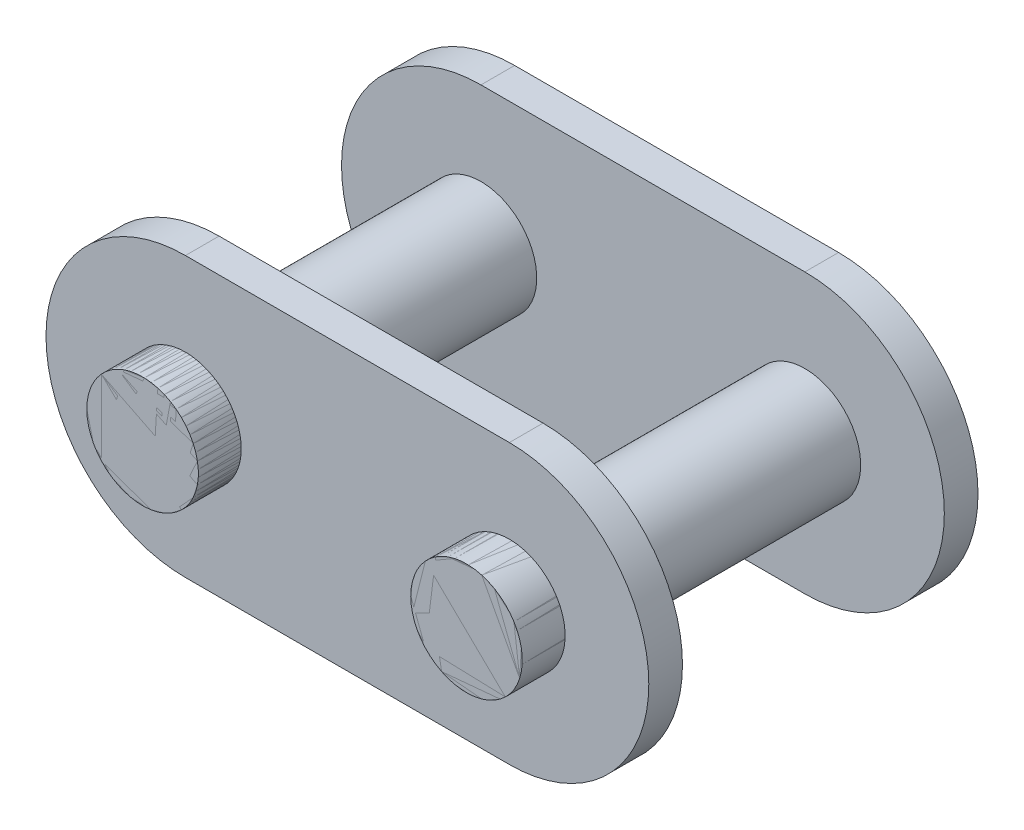
ISO-10303-21;
HEADER;
FILE_DESCRIPTION(('STEP AP214'),'2;1');
FILE_NAME('part.step','',(''),(''),'','','');
FILE_SCHEMA(('AUTOMOTIVE_DESIGN { 1 0 10303 214 1 1 1 1 }'));
ENDSEC;
DATA;
#1=APPLICATION_CONTEXT('core data for automotive mechanical design processes');
#2=APPLICATION_PROTOCOL_DEFINITION('international standard','automotive_design',2000,#1);
#3=PRODUCT_CONTEXT('',#1,'mechanical');
#4=PRODUCT('Part','Part','',(#3));
#5=PRODUCT_RELATED_PRODUCT_CATEGORY('part','',(#4));
#6=PRODUCT_DEFINITION_FORMATION('','',#4);
#7=PRODUCT_DEFINITION_CONTEXT('part definition',#1,'design');
#8=PRODUCT_DEFINITION('design','',#6,#7);
#9=PRODUCT_DEFINITION_SHAPE('','',#8);
#10=(LENGTH_UNIT() NAMED_UNIT(*) SI_UNIT(.MILLI.,.METRE.));
#11=(NAMED_UNIT(*) PLANE_ANGLE_UNIT() SI_UNIT($,.RADIAN.));
#12=(NAMED_UNIT(*) SI_UNIT($,.STERADIAN.) SOLID_ANGLE_UNIT());
#13=UNCERTAINTY_MEASURE_WITH_UNIT(LENGTH_MEASURE(1.E-05),#10,'distance_accuracy_value','');
#14=(GEOMETRIC_REPRESENTATION_CONTEXT(3) GLOBAL_UNCERTAINTY_ASSIGNED_CONTEXT((#13)) GLOBAL_UNIT_ASSIGNED_CONTEXT((#10,
#11,#12)) REPRESENTATION_CONTEXT('',''));
#15=CARTESIAN_POINT('',(0.,0.,0.));
#16=DIRECTION('',(0.,0.,1.));
#17=DIRECTION('',(1.,0.,0.));
#18=AXIS2_PLACEMENT_3D('',#15,#16,#17);
#19=CARTESIAN_POINT('',(9.525,0.,-8.69));
#20=DIRECTION('',(0.,0.,1.));
#21=DIRECTION('',(-1.,0.,0.));
#22=AXIS2_PLACEMENT_3D('',#19,#20,#21);
#23=PLANE('',#22);
#24=CARTESIAN_POINT('',(9.525,0.,-8.69));
#25=DIRECTION('',(0.,0.,1.));
#26=DIRECTION('',(-1.,0.,0.));
#27=AXIS2_PLACEMENT_3D('',#24,#25,#26);
#28=CIRCLE('',#27,4.1);
#29=CARTESIAN_POINT('',(9.525,-4.1,-8.69));
#30=VERTEX_POINT('',#29);
#31=CARTESIAN_POINT('',(9.525,4.1,-8.69));
#32=VERTEX_POINT('',#31);
#33=EDGE_CURVE('E111',#30,#32,#28,.T.);
#34=ORIENTED_EDGE('',*,*,#33,.F.);
#35=DIRECTION('',(1.,0.,0.));
#36=VECTOR('',#35,1.);
#37=CARTESIAN_POINT('',(0.,-4.1,-8.69));
#38=LINE('',#37,#36);
#39=CARTESIAN_POINT('',(0.,-4.1,-8.69));
#40=VERTEX_POINT('',#39);
#41=EDGE_CURVE('E114',#40,#30,#38,.T.);
#42=ORIENTED_EDGE('',*,*,#41,.F.);
#43=CARTESIAN_POINT('',(0.,0.,-8.69));
#44=DIRECTION('',(0.,0.,1.));
#45=DIRECTION('',(1.,0.,0.));
#46=AXIS2_PLACEMENT_3D('',#43,#44,#45);
#47=CIRCLE('',#46,4.1);
#48=CARTESIAN_POINT('',(0.,4.1,-8.69));
#49=VERTEX_POINT('',#48);
#50=EDGE_CURVE('E102',#49,#40,#47,.T.);
#51=ORIENTED_EDGE('',*,*,#50,.F.);
#52=DIRECTION('',(-1.,0.,0.));
#53=VECTOR('',#52,1.);
#54=CARTESIAN_POINT('',(0.,4.1,-8.69));
#55=LINE('',#54,#53);
#56=EDGE_CURVE('E107',#32,#49,#55,.T.);
#57=ORIENTED_EDGE('',*,*,#56,.F.);
#58=EDGE_LOOP('',(#34,#42,#51,#57));
#59=FACE_BOUND('',#58,.T.);
#60=CARTESIAN_POINT('',(0.,0.,-8.69));
#61=DIRECTION('',(0.,0.,1.));
#62=DIRECTION('',(1.,0.,0.));
#63=AXIS2_PLACEMENT_3D('',#60,#61,#62);
#64=CIRCLE('',#63,1.64);
#65=CARTESIAN_POINT('',(1.64,0.,-8.69));
#66=VERTEX_POINT('',#65);
#67=EDGE_CURVE('E123',#66,#66,#64,.T.);
#68=ORIENTED_EDGE('',*,*,#67,.T.);
#69=EDGE_LOOP('',(#68));
#70=FACE_BOUND('',#69,.T.);
#71=CARTESIAN_POINT('',(9.525,0.,-8.69));
#72=DIRECTION('',(0.,0.,1.));
#73=DIRECTION('',(-1.,0.,0.));
#74=AXIS2_PLACEMENT_3D('',#71,#72,#73);
#75=CIRCLE('',#74,1.64);
#76=CARTESIAN_POINT('',(7.88500000000001,0.,-8.69));
#77=VERTEX_POINT('',#76);
#78=EDGE_CURVE('E133',#77,#77,#75,.T.);
#79=ORIENTED_EDGE('',*,*,#78,.T.);
#80=EDGE_LOOP('',(#79));
#81=FACE_BOUND('',#80,.T.);
#82=ADVANCED_FACE('F55',(#59,#70,#81),#23,.F.);
#83=CARTESIAN_POINT('',(9.525,0.,-7.7));
#84=DIRECTION('',(0.,0.,1.));
#85=DIRECTION('',(-1.,0.,0.));
#86=AXIS2_PLACEMENT_3D('',#83,#84,#85);
#87=PLANE('',#86);
#88=CARTESIAN_POINT('',(0.,0.,-7.7));
#89=DIRECTION('',(0.,0.,-1.));
#90=DIRECTION('',(-1.,0.,0.));
#91=AXIS2_PLACEMENT_3D('',#88,#89,#90);
#92=CIRCLE('',#91,1.64);
#93=CARTESIAN_POINT('',(-1.64,0.,-7.7));
#94=VERTEX_POINT('',#93);
#95=EDGE_CURVE('E145',#94,#94,#92,.T.);
#96=ORIENTED_EDGE('',*,*,#95,.T.);
#97=EDGE_LOOP('',(#96));
#98=FACE_BOUND('',#97,.T.);
#99=CARTESIAN_POINT('',(9.525,0.,-7.7));
#100=DIRECTION('',(0.,0.,1.));
#101=DIRECTION('',(-1.,0.,0.));
#102=AXIS2_PLACEMENT_3D('',#99,#100,#101);
#103=CIRCLE('',#102,4.1);
#104=CARTESIAN_POINT('',(9.525,-4.1,-7.7));
#105=VERTEX_POINT('',#104);
#106=CARTESIAN_POINT('',(9.525,4.1,-7.7));
#107=VERTEX_POINT('',#106);
#108=EDGE_CURVE('E119',#105,#107,#103,.T.);
#109=ORIENTED_EDGE('',*,*,#108,.T.);
#110=DIRECTION('',(-1.,0.,0.));
#111=VECTOR('',#110,1.);
#112=CARTESIAN_POINT('',(0.,4.1,-7.7));
#113=LINE('',#112,#111);
#114=CARTESIAN_POINT('',(0.,4.1,-7.7));
#115=VERTEX_POINT('',#114);
#116=EDGE_CURVE('E122',#107,#115,#113,.T.);
#117=ORIENTED_EDGE('',*,*,#116,.T.);
#118=CARTESIAN_POINT('',(0.,0.,-7.7));
#119=DIRECTION('',(0.,0.,1.));
#120=DIRECTION('',(1.,0.,0.));
#121=AXIS2_PLACEMENT_3D('',#118,#119,#120);
#122=CIRCLE('',#121,4.1);
#123=CARTESIAN_POINT('',(0.,-4.1,-7.7));
#124=VERTEX_POINT('',#123);
#125=EDGE_CURVE('E105',#115,#124,#122,.T.);
#126=ORIENTED_EDGE('',*,*,#125,.T.);
#127=DIRECTION('',(1.,0.,0.));
#128=VECTOR('',#127,1.);
#129=CARTESIAN_POINT('',(0.,-4.1,-7.7));
#130=LINE('',#129,#128);
#131=EDGE_CURVE('E126',#124,#105,#130,.T.);
#132=ORIENTED_EDGE('',*,*,#131,.T.);
#133=EDGE_LOOP('',(#109,#117,#126,#132));
#134=FACE_BOUND('',#133,.T.);
#135=CARTESIAN_POINT('',(9.525,0.,-7.7));
#136=DIRECTION('',(0.,0.,-1.));
#137=DIRECTION('',(-1.,0.,0.));
#138=AXIS2_PLACEMENT_3D('',#135,#136,#137);
#139=CIRCLE('',#138,1.64);
#140=CARTESIAN_POINT('',(7.885,0.,-7.7));
#141=VERTEX_POINT('',#140);
#142=EDGE_CURVE('E136',#141,#141,#139,.T.);
#143=ORIENTED_EDGE('',*,*,#142,.T.);
#144=EDGE_LOOP('',(#143));
#145=FACE_BOUND('',#144,.T.);
#146=ADVANCED_FACE('F165',(#98,#134,#145),#87,.T.);
#147=CARTESIAN_POINT('',(9.525,0.,-8.69));
#148=DIRECTION('',(0.,0.,1.));
#149=DIRECTION('',(-1.,0.,0.));
#150=AXIS2_PLACEMENT_3D('',#147,#148,#149);
#151=CYLINDRICAL_SURFACE('',#150,4.1);
#152=ORIENTED_EDGE('',*,*,#108,.F.);
#153=DIRECTION('',(0.,0.,1.));
#154=VECTOR('',#153,1.);
#155=CARTESIAN_POINT('',(9.525,-4.1,-8.69));
#156=LINE('',#155,#154);
#157=EDGE_CURVE('E72',#30,#105,#156,.T.);
#158=ORIENTED_EDGE('',*,*,#157,.F.);
#159=ORIENTED_EDGE('',*,*,#33,.T.);
#160=DIRECTION('',(0.,0.,1.));
#161=VECTOR('',#160,1.);
#162=CARTESIAN_POINT('',(9.525,4.1,-8.69));
#163=LINE('',#162,#161);
#164=EDGE_CURVE('E12',#32,#107,#163,.T.);
#165=ORIENTED_EDGE('',*,*,#164,.T.);
#166=EDGE_LOOP('',(#152,#158,#159,#165));
#167=FACE_BOUND('',#166,.T.);
#168=ADVANCED_FACE('F57',(#167),#151,.T.);
#169=CARTESIAN_POINT('',(0.,4.1,-8.69));
#170=DIRECTION('',(0.,-1.,0.));
#171=DIRECTION('',(1.,0.,0.));
#172=AXIS2_PLACEMENT_3D('',#169,#170,#171);
#173=PLANE('',#172);
#174=ORIENTED_EDGE('',*,*,#116,.F.);
#175=ORIENTED_EDGE('',*,*,#164,.F.);
#176=ORIENTED_EDGE('',*,*,#56,.T.);
#177=DIRECTION('',(0.,0.,1.));
#178=VECTOR('',#177,1.);
#179=CARTESIAN_POINT('',(0.,4.1,-8.69));
#180=LINE('',#179,#178);
#181=EDGE_CURVE('E64',#49,#115,#180,.T.);
#182=ORIENTED_EDGE('',*,*,#181,.T.);
#183=EDGE_LOOP('',(#174,#175,#176,#182));
#184=FACE_BOUND('',#183,.T.);
#185=ADVANCED_FACE('F108',(#184),#173,.F.);
#186=CARTESIAN_POINT('',(0.,0.,-8.69));
#187=DIRECTION('',(0.,0.,1.));
#188=DIRECTION('',(-1.,0.,0.));
#189=AXIS2_PLACEMENT_3D('',#186,#187,#188);
#190=CYLINDRICAL_SURFACE('',#189,4.1);
#191=ORIENTED_EDGE('',*,*,#125,.F.);
#192=ORIENTED_EDGE('',*,*,#181,.F.);
#193=ORIENTED_EDGE('',*,*,#50,.T.);
#194=DIRECTION('',(0.,0.,1.));
#195=VECTOR('',#194,1.);
#196=CARTESIAN_POINT('',(0.,-4.1,-8.69));
#197=LINE('',#196,#195);
#198=EDGE_CURVE('E88',#40,#124,#197,.T.);
#199=ORIENTED_EDGE('',*,*,#198,.T.);
#200=EDGE_LOOP('',(#191,#192,#193,#199));
#201=FACE_BOUND('',#200,.T.);
#202=ADVANCED_FACE('F100',(#201),#190,.T.);
#203=CARTESIAN_POINT('',(0.,-4.1,-8.69));
#204=DIRECTION('',(0.,1.,0.));
#205=DIRECTION('',(-1.,0.,0.));
#206=AXIS2_PLACEMENT_3D('',#203,#204,#205);
#207=PLANE('',#206);
#208=ORIENTED_EDGE('',*,*,#131,.F.);
#209=ORIENTED_EDGE('',*,*,#198,.F.);
#210=ORIENTED_EDGE('',*,*,#41,.T.);
#211=ORIENTED_EDGE('',*,*,#157,.T.);
#212=EDGE_LOOP('',(#208,#209,#210,#211));
#213=FACE_BOUND('',#212,.T.);
#214=ADVANCED_FACE('F190',(#213),#207,.F.);
#215=CARTESIAN_POINT('',(9.525,0.,2.25));
#216=DIRECTION('',(0.,0.,1.));
#217=DIRECTION('',(-1.,0.,0.));
#218=AXIS2_PLACEMENT_3D('',#215,#216,#217);
#219=PLANE('',#218);
#220=CARTESIAN_POINT('',(9.525,0.,2.25));
#221=DIRECTION('',(0.,0.,-1.));
#222=DIRECTION('',(-1.,0.,0.));
#223=AXIS2_PLACEMENT_3D('',#220,#221,#222);
#224=CIRCLE('',#223,1.64);
#225=CARTESIAN_POINT('',(7.885,0.,2.25));
#226=VERTEX_POINT('',#225);
#227=EDGE_CURVE('E142',#226,#226,#224,.T.);
#228=ORIENTED_EDGE('',*,*,#227,.F.);
#229=EDGE_LOOP('',(#228));
#230=FACE_BOUND('',#229,.T.);
#231=ADVANCED_FACE('F182',(#230),#219,.T.);
#232=CARTESIAN_POINT('',(9.525,0.,-9.95));
#233=DIRECTION('',(0.,0.,1.));
#234=DIRECTION('',(-1.,0.,0.));
#235=AXIS2_PLACEMENT_3D('',#232,#233,#234);
#236=CYLINDRICAL_SURFACE('',#235,1.64);
#237=ORIENTED_EDGE('',*,*,#142,.F.);
#238=EDGE_LOOP('',(#237));
#239=FACE_BOUND('',#238,.T.);
#240=ORIENTED_EDGE('',*,*,#227,.T.);
#241=EDGE_LOOP('',(#240));
#242=FACE_BOUND('',#241,.T.);
#243=ADVANCED_FACE('F172',(#239,#242),#236,.T.);
#244=CARTESIAN_POINT('',(9.525,0.,-9.95));
#245=DIRECTION('',(0.,0.,-1.));
#246=DIRECTION('',(-1.,0.,0.));
#247=AXIS2_PLACEMENT_3D('',#244,#245,#246);
#248=CIRCLE('',#247,1.64);
#249=CARTESIAN_POINT('',(7.885,0.,-9.95));
#250=VERTEX_POINT('',#249);
#251=EDGE_CURVE('E139',#250,#250,#248,.T.);
#252=ORIENTED_EDGE('',*,*,#251,.F.);
#253=EDGE_LOOP('',(#252));
#254=FACE_BOUND('',#253,.T.);
#255=ORIENTED_EDGE('',*,*,#78,.F.);
#256=EDGE_LOOP('',(#255));
#257=FACE_BOUND('',#256,.T.);
#258=ADVANCED_FACE('F169',(#254,#257),#236,.T.);
#259=CARTESIAN_POINT('',(9.525,0.,-9.95));
#260=DIRECTION('',(0.,0.,1.));
#261=DIRECTION('',(-1.,0.,0.));
#262=AXIS2_PLACEMENT_3D('',#259,#260,#261);
#263=PLANE('',#262);
#264=ORIENTED_EDGE('',*,*,#251,.T.);
#265=EDGE_LOOP('',(#264));
#266=FACE_BOUND('',#265,.T.);
#267=ADVANCED_FACE('F171',(#266),#263,.F.);
#268=CARTESIAN_POINT('',(0.,0.,2.25));
#269=DIRECTION('',(0.,0.,1.));
#270=DIRECTION('',(-1.,0.,0.));
#271=AXIS2_PLACEMENT_3D('',#268,#269,#270);
#272=PLANE('',#271);
#273=CARTESIAN_POINT('',(0.,0.,2.25));
#274=DIRECTION('',(0.,0.,-1.));
#275=DIRECTION('',(-1.,0.,0.));
#276=AXIS2_PLACEMENT_3D('',#273,#274,#275);
#277=CIRCLE('',#276,1.64);
#278=CARTESIAN_POINT('',(-1.64,0.,2.25));
#279=VERTEX_POINT('',#278);
#280=EDGE_CURVE('E148',#279,#279,#277,.T.);
#281=ORIENTED_EDGE('',*,*,#280,.F.);
#282=EDGE_LOOP('',(#281));
#283=FACE_BOUND('',#282,.T.);
#284=ADVANCED_FACE('F179',(#283),#272,.T.);
#285=CARTESIAN_POINT('',(0.,0.,-9.95));
#286=DIRECTION('',(0.,0.,1.));
#287=DIRECTION('',(-1.,0.,0.));
#288=AXIS2_PLACEMENT_3D('',#285,#286,#287);
#289=CYLINDRICAL_SURFACE('',#288,1.64);
#290=ORIENTED_EDGE('',*,*,#95,.F.);
#291=EDGE_LOOP('',(#290));
#292=FACE_BOUND('',#291,.T.);
#293=ORIENTED_EDGE('',*,*,#280,.T.);
#294=EDGE_LOOP('',(#293));
#295=FACE_BOUND('',#294,.T.);
#296=ADVANCED_FACE('F160',(#292,#295),#289,.T.);
#297=CARTESIAN_POINT('',(0.,0.,-9.95));
#298=DIRECTION('',(0.,0.,-1.));
#299=DIRECTION('',(-1.,0.,0.));
#300=AXIS2_PLACEMENT_3D('',#297,#298,#299);
#301=CIRCLE('',#300,1.64);
#302=CARTESIAN_POINT('',(-1.64,0.,-9.95));
#303=VERTEX_POINT('',#302);
#304=EDGE_CURVE('E151',#303,#303,#301,.T.);
#305=ORIENTED_EDGE('',*,*,#304,.F.);
#306=EDGE_LOOP('',(#305));
#307=FACE_BOUND('',#306,.T.);
#308=ORIENTED_EDGE('',*,*,#67,.F.);
#309=EDGE_LOOP('',(#308));
#310=FACE_BOUND('',#309,.T.);
#311=ADVANCED_FACE('F157',(#307,#310),#289,.T.);
#312=CARTESIAN_POINT('',(0.,0.,-9.95));
#313=DIRECTION('',(0.,0.,1.));
#314=DIRECTION('',(-1.,0.,0.));
#315=AXIS2_PLACEMENT_3D('',#312,#313,#314);
#316=PLANE('',#315);
#317=ORIENTED_EDGE('',*,*,#304,.T.);
#318=EDGE_LOOP('',(#317));
#319=FACE_BOUND('',#318,.T.);
#320=ADVANCED_FACE('F155',(#319),#316,.F.);
#321=CLOSED_SHELL('',(#82,#146,#168,#185,#202,#214,#231,#243,#258,#267,#284,#296,#311,#320));
#322=MANIFOLD_SOLID_BREP('B2',#321);
#323=CARTESIAN_POINT('',(9.525,0.,0.99));
#324=DIRECTION('',(0.,0.,-1.));
#325=DIRECTION('',(-1.,0.,0.));
#326=AXIS2_PLACEMENT_3D('',#323,#324,#325);
#327=PLANE('',#326);
#328=CARTESIAN_POINT('',(9.525,0.,0.99));
#329=DIRECTION('',(0.,0.,1.));
#330=DIRECTION('',(-1.,0.,0.));
#331=AXIS2_PLACEMENT_3D('',#328,#329,#330);
#332=CIRCLE('',#331,4.1);
#333=CARTESIAN_POINT('',(9.525,-4.1,0.99));
#334=VERTEX_POINT('',#333);
#335=CARTESIAN_POINT('',(9.525,4.1,0.99));
#336=VERTEX_POINT('',#335);
#337=EDGE_CURVE('E350',#334,#336,#332,.T.);
#338=ORIENTED_EDGE('',*,*,#337,.T.);
#339=DIRECTION('',(-1.,0.,0.));
#340=VECTOR('',#339,1.);
#341=CARTESIAN_POINT('',(0.,4.1,0.99));
#342=LINE('',#341,#340);
#343=CARTESIAN_POINT('',(0.,4.1,0.99));
#344=VERTEX_POINT('',#343);
#345=EDGE_CURVE('E345',#336,#344,#342,.T.);
#346=ORIENTED_EDGE('',*,*,#345,.T.);
#347=CARTESIAN_POINT('',(0.,0.,0.99));
#348=DIRECTION('',(0.,0.,1.));
#349=DIRECTION('',(1.,0.,0.));
#350=AXIS2_PLACEMENT_3D('',#347,#348,#349);
#351=CIRCLE('',#350,4.1);
#352=CARTESIAN_POINT('',(0.,-4.1,0.99));
#353=VERTEX_POINT('',#352);
#354=EDGE_CURVE('E348',#344,#353,#351,.T.);
#355=ORIENTED_EDGE('',*,*,#354,.T.);
#356=DIRECTION('',(1.,0.,0.));
#357=VECTOR('',#356,1.);
#358=CARTESIAN_POINT('',(0.,-4.1,0.99));
#359=LINE('',#358,#357);
#360=EDGE_CURVE('E315',#353,#334,#359,.T.);
#361=ORIENTED_EDGE('',*,*,#360,.T.);
#362=EDGE_LOOP('',(#338,#346,#355,#361));
#363=FACE_BOUND('',#362,.T.);
#364=CARTESIAN_POINT('',(0.,0.,0.99));
#365=DIRECTION('',(0.,0.,1.));
#366=DIRECTION('',(1.,0.,0.));
#367=AXIS2_PLACEMENT_3D('',#364,#365,#366);
#368=CIRCLE('',#367,1.64);
#369=CARTESIAN_POINT('',(1.64,0.,0.99));
#370=VERTEX_POINT('',#369);
#371=EDGE_CURVE('E370',#370,#370,#368,.T.);
#372=ORIENTED_EDGE('',*,*,#371,.F.);
#373=EDGE_LOOP('',(#372));
#374=FACE_BOUND('',#373,.T.);
#375=CARTESIAN_POINT('',(9.525,0.,0.99));
#376=DIRECTION('',(0.,0.,1.));
#377=DIRECTION('',(-1.,0.,0.));
#378=AXIS2_PLACEMENT_3D('',#375,#376,#377);
#379=CIRCLE('',#378,1.64);
#380=CARTESIAN_POINT('',(7.88500000000001,0.,0.99));
#381=VERTEX_POINT('',#380);
#382=EDGE_CURVE('E391',#381,#381,#379,.T.);
#383=ORIENTED_EDGE('',*,*,#382,.F.);
#384=EDGE_LOOP('',(#383));
#385=FACE_BOUND('',#384,.T.);
#386=ADVANCED_FACE('F297',(#363,#374,#385),#327,.F.);
#387=CARTESIAN_POINT('',(9.525,0.,0.));
#388=DIRECTION('',(0.,0.,-1.));
#389=DIRECTION('',(-1.,0.,0.));
#390=AXIS2_PLACEMENT_3D('',#387,#388,#389);
#391=PLANE('',#390);
#392=CARTESIAN_POINT('',(0.,0.,0.));
#393=DIRECTION('',(0.,0.,-1.));
#394=DIRECTION('',(-1.,0.,0.));
#395=AXIS2_PLACEMENT_3D('',#392,#393,#394);
#396=CIRCLE('',#395,1.64);
#397=CARTESIAN_POINT('',(-1.64,0.,0.));
#398=VERTEX_POINT('',#397);
#399=EDGE_CURVE('E407',#398,#398,#396,.T.);
#400=ORIENTED_EDGE('',*,*,#399,.F.);
#401=EDGE_LOOP('',(#400));
#402=FACE_BOUND('',#401,.T.);
#403=CARTESIAN_POINT('',(9.525,0.,0.));
#404=DIRECTION('',(0.,0.,1.));
#405=DIRECTION('',(-1.,0.,0.));
#406=AXIS2_PLACEMENT_3D('',#403,#404,#405);
#407=CIRCLE('',#406,4.1);
#408=CARTESIAN_POINT('',(9.525,-4.1,0.));
#409=VERTEX_POINT('',#408);
#410=CARTESIAN_POINT('',(9.525,4.1,0.));
#411=VERTEX_POINT('',#410);
#412=EDGE_CURVE('E366',#409,#411,#407,.T.);
#413=ORIENTED_EDGE('',*,*,#412,.F.);
#414=DIRECTION('',(1.,0.,0.));
#415=VECTOR('',#414,1.);
#416=CARTESIAN_POINT('',(0.,-4.1,0.));
#417=LINE('',#416,#415);
#418=CARTESIAN_POINT('',(0.,-4.1,0.));
#419=VERTEX_POINT('',#418);
#420=EDGE_CURVE('E338',#419,#409,#417,.T.);
#421=ORIENTED_EDGE('',*,*,#420,.F.);
#422=CARTESIAN_POINT('',(0.,0.,0.));
#423=DIRECTION('',(0.,0.,1.));
#424=DIRECTION('',(1.,0.,0.));
#425=AXIS2_PLACEMENT_3D('',#422,#423,#424);
#426=CIRCLE('',#425,4.1);
#427=CARTESIAN_POINT('',(0.,4.1,0.));
#428=VERTEX_POINT('',#427);
#429=EDGE_CURVE('E332',#428,#419,#426,.T.);
#430=ORIENTED_EDGE('',*,*,#429,.F.);
#431=DIRECTION('',(-1.,0.,0.));
#432=VECTOR('',#431,1.);
#433=CARTESIAN_POINT('',(0.,4.1,0.));
#434=LINE('',#433,#432);
#435=EDGE_CURVE('E355',#411,#428,#434,.T.);
#436=ORIENTED_EDGE('',*,*,#435,.F.);
#437=EDGE_LOOP('',(#413,#421,#430,#436));
#438=FACE_BOUND('',#437,.T.);
#439=CARTESIAN_POINT('',(9.525,0.,0.));
#440=DIRECTION('',(0.,0.,-1.));
#441=DIRECTION('',(-1.,0.,0.));
#442=AXIS2_PLACEMENT_3D('',#439,#440,#441);
#443=CIRCLE('',#442,1.64);
#444=CARTESIAN_POINT('',(7.885,0.,0.));
#445=VERTEX_POINT('',#444);
#446=EDGE_CURVE('E395',#445,#445,#443,.T.);
#447=ORIENTED_EDGE('',*,*,#446,.F.);
#448=EDGE_LOOP('',(#447));
#449=FACE_BOUND('',#448,.T.);
#450=ADVANCED_FACE('F383',(#402,#438,#449),#391,.T.);
#451=CARTESIAN_POINT('',(9.525,0.,0.99));
#452=DIRECTION('',(0.,0.,-1.));
#453=DIRECTION('',(-1.,0.,0.));
#454=AXIS2_PLACEMENT_3D('',#451,#452,#453);
#455=CYLINDRICAL_SURFACE('',#454,4.1);
#456=ORIENTED_EDGE('',*,*,#412,.T.);
#457=DIRECTION('',(0.,0.,-1.));
#458=VECTOR('',#457,1.);
#459=CARTESIAN_POINT('',(9.525,4.1,0.99));
#460=LINE('',#459,#458);
#461=EDGE_CURVE('E53',#336,#411,#460,.T.);
#462=ORIENTED_EDGE('',*,*,#461,.F.);
#463=ORIENTED_EDGE('',*,*,#337,.F.);
#464=DIRECTION('',(0.,0.,-1.));
#465=VECTOR('',#464,1.);
#466=CARTESIAN_POINT('',(9.525,-4.1,0.99));
#467=LINE('',#466,#465);
#468=EDGE_CURVE('E362',#334,#409,#467,.T.);
#469=ORIENTED_EDGE('',*,*,#468,.T.);
#470=EDGE_LOOP('',(#456,#462,#463,#469));
#471=FACE_BOUND('',#470,.T.);
#472=ADVANCED_FACE('F299',(#471),#455,.T.);
#473=CARTESIAN_POINT('',(0.,4.1,0.99));
#474=DIRECTION('',(0.,-1.,0.));
#475=DIRECTION('',(1.,0.,0.));
#476=AXIS2_PLACEMENT_3D('',#473,#474,#475);
#477=PLANE('',#476);
#478=ORIENTED_EDGE('',*,*,#435,.T.);
#479=DIRECTION('',(0.,0.,-1.));
#480=VECTOR('',#479,1.);
#481=CARTESIAN_POINT('',(0.,4.1,0.99));
#482=LINE('',#481,#480);
#483=EDGE_CURVE('E307',#344,#428,#482,.T.);
#484=ORIENTED_EDGE('',*,*,#483,.F.);
#485=ORIENTED_EDGE('',*,*,#345,.F.);
#486=ORIENTED_EDGE('',*,*,#461,.T.);
#487=EDGE_LOOP('',(#478,#484,#485,#486));
#488=FACE_BOUND('',#487,.T.);
#489=ADVANCED_FACE('F354',(#488),#477,.F.);
#490=CARTESIAN_POINT('',(0.,0.,0.99));
#491=DIRECTION('',(0.,0.,-1.));
#492=DIRECTION('',(-1.,0.,0.));
#493=AXIS2_PLACEMENT_3D('',#490,#491,#492);
#494=CYLINDRICAL_SURFACE('',#493,4.1);
#495=ORIENTED_EDGE('',*,*,#429,.T.);
#496=DIRECTION('',(0.,0.,-1.));
#497=VECTOR('',#496,1.);
#498=CARTESIAN_POINT('',(0.,-4.1,0.99));
#499=LINE('',#498,#497);
#500=EDGE_CURVE('E357',#353,#419,#499,.T.);
#501=ORIENTED_EDGE('',*,*,#500,.F.);
#502=ORIENTED_EDGE('',*,*,#354,.F.);
#503=ORIENTED_EDGE('',*,*,#483,.T.);
#504=EDGE_LOOP('',(#495,#501,#502,#503));
#505=FACE_BOUND('',#504,.T.);
#506=ADVANCED_FACE('F358',(#505),#494,.T.);
#507=CARTESIAN_POINT('',(0.,-4.1,0.99));
#508=DIRECTION('',(0.,1.,0.));
#509=DIRECTION('',(-1.,0.,0.));
#510=AXIS2_PLACEMENT_3D('',#507,#508,#509);
#511=PLANE('',#510);
#512=ORIENTED_EDGE('',*,*,#420,.T.);
#513=ORIENTED_EDGE('',*,*,#468,.F.);
#514=ORIENTED_EDGE('',*,*,#360,.F.);
#515=ORIENTED_EDGE('',*,*,#500,.T.);
#516=EDGE_LOOP('',(#512,#513,#514,#515));
#517=FACE_BOUND('',#516,.T.);
#518=ADVANCED_FACE('F380',(#517),#511,.F.);
#519=CARTESIAN_POINT('',(9.525,0.,-9.95));
#520=DIRECTION('',(0.,0.,-1.));
#521=DIRECTION('',(-1.,0.,0.));
#522=AXIS2_PLACEMENT_3D('',#519,#520,#521);
#523=PLANE('',#522);
#524=CARTESIAN_POINT('',(9.525,0.,-9.95));
#525=DIRECTION('',(0.,0.,-1.));
#526=DIRECTION('',(-1.,0.,0.));
#527=AXIS2_PLACEMENT_3D('',#524,#525,#526);
#528=CIRCLE('',#527,1.64);
#529=CARTESIAN_POINT('',(7.885,0.,-9.95));
#530=VERTEX_POINT('',#529);
#531=EDGE_CURVE('E403',#530,#530,#528,.T.);
#532=ORIENTED_EDGE('',*,*,#531,.T.);
#533=EDGE_LOOP('',(#532));
#534=FACE_BOUND('',#533,.T.);
#535=ADVANCED_FACE('F445',(#534),#523,.T.);
#536=CARTESIAN_POINT('',(9.525,0.,2.25));
#537=DIRECTION('',(0.,0.,-1.));
#538=DIRECTION('',(-1.,0.,0.));
#539=AXIS2_PLACEMENT_3D('',#536,#537,#538);
#540=CYLINDRICAL_SURFACE('',#539,1.64);
#541=ORIENTED_EDGE('',*,*,#446,.T.);
#542=EDGE_LOOP('',(#541));
#543=FACE_BOUND('',#542,.T.);
#544=ORIENTED_EDGE('',*,*,#531,.F.);
#545=EDGE_LOOP('',(#544));
#546=FACE_BOUND('',#545,.T.);
#547=ADVANCED_FACE('F440',(#543,#546),#540,.T.);
#548=CARTESIAN_POINT('',(9.525,0.,2.25));
#549=DIRECTION('',(0.,0.,-1.));
#550=DIRECTION('',(-1.,0.,0.));
#551=AXIS2_PLACEMENT_3D('',#548,#549,#550);
#552=CIRCLE('',#551,1.64);
#553=CARTESIAN_POINT('',(7.885,0.,2.25));
#554=VERTEX_POINT('',#553);
#555=EDGE_CURVE('E399',#554,#554,#552,.T.);
#556=ORIENTED_EDGE('',*,*,#555,.T.);
#557=EDGE_LOOP('',(#556));
#558=FACE_BOUND('',#557,.T.);
#559=ORIENTED_EDGE('',*,*,#382,.T.);
#560=EDGE_LOOP('',(#559));
#561=FACE_BOUND('',#560,.T.);
#562=ADVANCED_FACE('F494',(#558,#561),#540,.T.);
#563=CARTESIAN_POINT('',(9.525,0.,2.25));
#564=DIRECTION('',(0.,0.,-1.));
#565=DIRECTION('',(-1.,0.,0.));
#566=AXIS2_PLACEMENT_3D('',#563,#564,#565);
#567=PLANE('',#566);
#568=ORIENTED_EDGE('',*,*,#555,.F.);
#569=EDGE_LOOP('',(#568));
#570=FACE_BOUND('',#569,.T.);
#571=ADVANCED_FACE('F502',(#570),#567,.F.);
#572=CARTESIAN_POINT('',(0.,0.,-9.95));
#573=DIRECTION('',(0.,0.,-1.));
#574=DIRECTION('',(-1.,0.,0.));
#575=AXIS2_PLACEMENT_3D('',#572,#573,#574);
#576=PLANE('',#575);
#577=CARTESIAN_POINT('',(0.,0.,-9.95));
#578=DIRECTION('',(0.,0.,-1.));
#579=DIRECTION('',(-1.,0.,0.));
#580=AXIS2_PLACEMENT_3D('',#577,#578,#579);
#581=CIRCLE('',#580,1.64);
#582=CARTESIAN_POINT('',(-1.64,0.,-9.95));
#583=VERTEX_POINT('',#582);
#584=EDGE_CURVE('E411',#583,#583,#581,.T.);
#585=ORIENTED_EDGE('',*,*,#584,.T.);
#586=EDGE_LOOP('',(#585));
#587=FACE_BOUND('',#586,.T.);
#588=ADVANCED_FACE('F510',(#587),#576,.T.);
#589=CARTESIAN_POINT('',(0.,0.,2.25));
#590=DIRECTION('',(0.,0.,-1.));
#591=DIRECTION('',(-1.,0.,0.));
#592=AXIS2_PLACEMENT_3D('',#589,#590,#591);
#593=CYLINDRICAL_SURFACE('',#592,1.64);
#594=ORIENTED_EDGE('',*,*,#399,.T.);
#595=EDGE_LOOP('',(#594));
#596=FACE_BOUND('',#595,.T.);
#597=ORIENTED_EDGE('',*,*,#584,.F.);
#598=EDGE_LOOP('',(#597));
#599=FACE_BOUND('',#598,.T.);
#600=ADVANCED_FACE('F429',(#596,#599),#593,.T.);
#601=CARTESIAN_POINT('',(0.,0.,2.25));
#602=DIRECTION('',(0.,0.,-1.));
#603=DIRECTION('',(-1.,0.,0.));
#604=AXIS2_PLACEMENT_3D('',#601,#602,#603);
#605=CIRCLE('',#604,1.64);
#606=CARTESIAN_POINT('',(-1.64,0.,2.25));
#607=VERTEX_POINT('',#606);
#608=EDGE_CURVE('E415',#607,#607,#605,.T.);
#609=ORIENTED_EDGE('',*,*,#608,.T.);
#610=EDGE_LOOP('',(#609));
#611=FACE_BOUND('',#610,.T.);
#612=ORIENTED_EDGE('',*,*,#371,.T.);
#613=EDGE_LOOP('',(#612));
#614=FACE_BOUND('',#613,.T.);
#615=ADVANCED_FACE('F420',(#611,#614),#593,.T.);
#616=CARTESIAN_POINT('',(0.,0.,2.25));
#617=DIRECTION('',(0.,0.,-1.));
#618=DIRECTION('',(-1.,0.,0.));
#619=AXIS2_PLACEMENT_3D('',#616,#617,#618);
#620=PLANE('',#619);
#621=ORIENTED_EDGE('',*,*,#608,.F.);
#622=EDGE_LOOP('',(#621));
#623=FACE_BOUND('',#622,.T.);
#624=ADVANCED_FACE('F423',(#623),#620,.F.);
#625=CLOSED_SHELL('',(#386,#450,#472,#489,#506,#518,#535,#547,#562,#571,#588,#600,#615,#624));
#626=MANIFOLD_SOLID_BREP('B6',#625);
#627=ADVANCED_BREP_SHAPE_REPRESENTATION('',(#18,#322,#626),#14);
#628=SHAPE_DEFINITION_REPRESENTATION(#9,#627);
ENDSEC;
END-ISO-10303-21;
